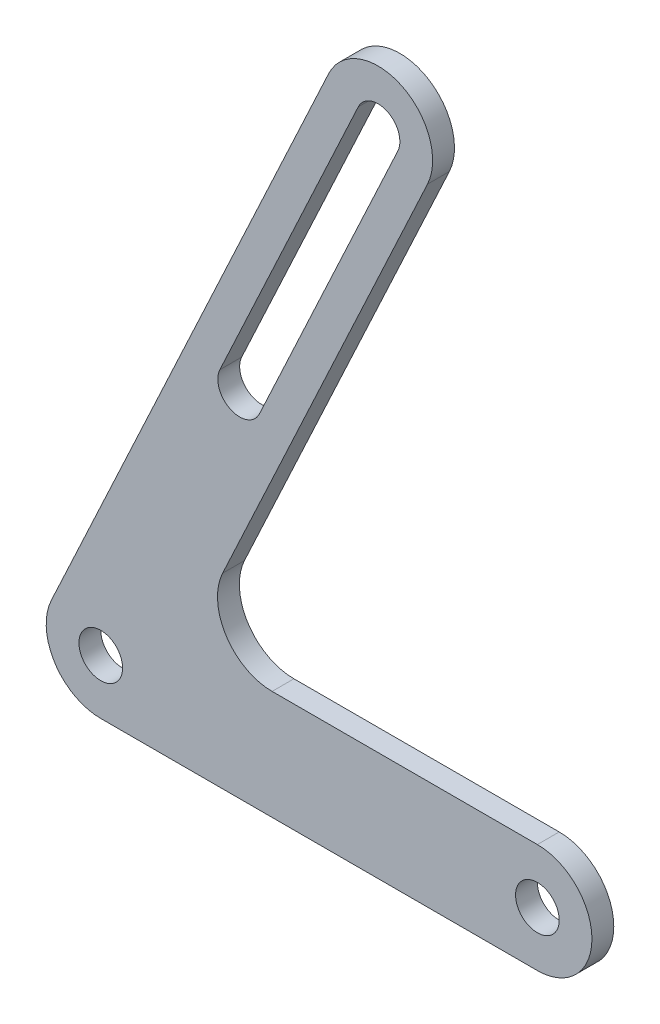
ISO-10303-21;
HEADER;
FILE_DESCRIPTION(('STEP AP214'),'2;1');
FILE_NAME('part.step','',(''),(''),'','','');
FILE_SCHEMA(('AUTOMOTIVE_DESIGN { 1 0 10303 214 1 1 1 1 }'));
ENDSEC;
DATA;
#1=APPLICATION_CONTEXT('core data for automotive mechanical design processes');
#2=APPLICATION_PROTOCOL_DEFINITION('international standard','automotive_design',2000,#1);
#3=PRODUCT_CONTEXT('',#1,'mechanical');
#4=PRODUCT('Part','Part','',(#3));
#5=PRODUCT_RELATED_PRODUCT_CATEGORY('part','',(#4));
#6=PRODUCT_DEFINITION_FORMATION('','',#4);
#7=PRODUCT_DEFINITION_CONTEXT('part definition',#1,'design');
#8=PRODUCT_DEFINITION('design','',#6,#7);
#9=PRODUCT_DEFINITION_SHAPE('','',#8);
#10=(LENGTH_UNIT() NAMED_UNIT(*) SI_UNIT(.MILLI.,.METRE.));
#11=(NAMED_UNIT(*) PLANE_ANGLE_UNIT() SI_UNIT($,.RADIAN.));
#12=(NAMED_UNIT(*) SI_UNIT($,.STERADIAN.) SOLID_ANGLE_UNIT());
#13=UNCERTAINTY_MEASURE_WITH_UNIT(LENGTH_MEASURE(1.E-05),#10,'distance_accuracy_value','');
#14=(GEOMETRIC_REPRESENTATION_CONTEXT(3) GLOBAL_UNCERTAINTY_ASSIGNED_CONTEXT((#13)) GLOBAL_UNIT_ASSIGNED_CONTEXT((#10,
#11,#12)) REPRESENTATION_CONTEXT('',''));
#15=CARTESIAN_POINT('',(0.,0.,0.));
#16=DIRECTION('',(0.,0.,1.));
#17=DIRECTION('',(1.,0.,0.));
#18=AXIS2_PLACEMENT_3D('',#15,#16,#17);
#19=CARTESIAN_POINT('',(-9.06307787036647,4.22618261740703,2.));
#20=DIRECTION('',(-0.906307787036648,0.422618261740704,0.));
#21=DIRECTION('',(-0.422618261740704,-0.906307787036648,0.));
#22=AXIS2_PLACEMENT_3D('',#19,#20,#21);
#23=PLANE('',#22);
#24=DIRECTION('',(0.422618261740704,0.906307787036648,0.));
#25=VECTOR('',#24,1.);
#26=CARTESIAN_POINT('',(-9.06307787036647,4.22618261740703,-2.));
#27=LINE('',#26,#25);
#28=CARTESIAN_POINT('',(-9.06307787036647,4.22618261740703,-2.));
#29=VERTEX_POINT('',#28);
#30=CARTESIAN_POINT('',(41.7428664291268,113.179881770692,-2.));
#31=VERTEX_POINT('',#30);
#32=EDGE_CURVE('E193',#29,#31,#27,.T.);
#33=ORIENTED_EDGE('',*,*,#32,.F.);
#34=DIRECTION('',(0.,0.,-1.));
#35=VECTOR('',#34,1.);
#36=CARTESIAN_POINT('',(-9.06307787036647,4.22618261740703,2.));
#37=LINE('',#36,#35);
#38=CARTESIAN_POINT('',(-9.06307787036647,4.22618261740703,2.));
#39=VERTEX_POINT('',#38);
#40=EDGE_CURVE('E259',#39,#29,#37,.T.);
#41=ORIENTED_EDGE('',*,*,#40,.F.);
#42=DIRECTION('',(0.422618261740704,0.906307787036648,0.));
#43=VECTOR('',#42,1.);
#44=CARTESIAN_POINT('',(-9.06307787036647,4.22618261740703,2.));
#45=LINE('',#44,#43);
#46=CARTESIAN_POINT('',(41.7428664291268,113.179881770692,2.));
#47=VERTEX_POINT('',#46);
#48=EDGE_CURVE('E194',#39,#47,#45,.T.);
#49=ORIENTED_EDGE('',*,*,#48,.T.);
#50=DIRECTION('',(0.,0.,-1.));
#51=VECTOR('',#50,1.);
#52=CARTESIAN_POINT('',(41.7428664291268,113.179881770692,2.));
#53=LINE('',#52,#51);
#54=EDGE_CURVE('E218',#47,#31,#53,.T.);
#55=ORIENTED_EDGE('',*,*,#54,.T.);
#56=EDGE_LOOP('',(#33,#41,#49,#55));
#57=FACE_BOUND('',#56,.T.);
#58=ADVANCED_FACE('F41',(#57),#23,.T.);
#59=CARTESIAN_POINT('',(0.,0.,2.));
#60=DIRECTION('',(0.,0.,-1.));
#61=DIRECTION('',(-1.,0.,0.));
#62=AXIS2_PLACEMENT_3D('',#59,#60,#61);
#63=CYLINDRICAL_SURFACE('',#62,10.);
#64=CARTESIAN_POINT('',(0.,0.,-2.));
#65=DIRECTION('',(0.,0.,1.));
#66=DIRECTION('',(1.,0.,0.));
#67=AXIS2_PLACEMENT_3D('',#64,#65,#66);
#68=CIRCLE('',#67,10.);
#69=CARTESIAN_POINT('',(0.,-10.,-2.));
#70=VERTEX_POINT('',#69);
#71=EDGE_CURVE('E222',#29,#70,#68,.T.);
#72=ORIENTED_EDGE('',*,*,#71,.T.);
#73=DIRECTION('',(0.,0.,-1.));
#74=VECTOR('',#73,1.);
#75=CARTESIAN_POINT('',(0.,-10.,2.));
#76=LINE('',#75,#74);
#77=CARTESIAN_POINT('',(0.,-10.,2.));
#78=VERTEX_POINT('',#77);
#79=EDGE_CURVE('E255',#78,#70,#76,.T.);
#80=ORIENTED_EDGE('',*,*,#79,.F.);
#81=CARTESIAN_POINT('',(0.,0.,2.));
#82=DIRECTION('',(0.,0.,1.));
#83=DIRECTION('',(1.,0.,0.));
#84=AXIS2_PLACEMENT_3D('',#81,#82,#83);
#85=CIRCLE('',#84,10.);
#86=EDGE_CURVE('E198',#39,#78,#85,.T.);
#87=ORIENTED_EDGE('',*,*,#86,.F.);
#88=ORIENTED_EDGE('',*,*,#40,.T.);
#89=EDGE_LOOP('',(#72,#80,#87,#88));
#90=FACE_BOUND('',#89,.T.);
#91=ADVANCED_FACE('F298',(#90),#63,.T.);
#92=CARTESIAN_POINT('',(0.,-10.,2.));
#93=DIRECTION('',(0.,1.,0.));
#94=DIRECTION('',(0.,0.,1.));
#95=AXIS2_PLACEMENT_3D('',#92,#93,#94);
#96=PLANE('',#95);
#97=DIRECTION('',(1.,0.,0.));
#98=VECTOR('',#97,1.);
#99=CARTESIAN_POINT('',(0.,-10.,-2.));
#100=LINE('',#99,#98);
#101=CARTESIAN_POINT('',(80.,-10.,-2.));
#102=VERTEX_POINT('',#101);
#103=EDGE_CURVE('E225',#70,#102,#100,.T.);
#104=ORIENTED_EDGE('',*,*,#103,.T.);
#105=DIRECTION('',(0.,0.,-1.));
#106=VECTOR('',#105,1.);
#107=CARTESIAN_POINT('',(80.,-10.,2.));
#108=LINE('',#107,#106);
#109=CARTESIAN_POINT('',(80.,-10.,2.));
#110=VERTEX_POINT('',#109);
#111=EDGE_CURVE('E251',#110,#102,#108,.T.);
#112=ORIENTED_EDGE('',*,*,#111,.F.);
#113=DIRECTION('',(1.,0.,0.));
#114=VECTOR('',#113,1.);
#115=CARTESIAN_POINT('',(0.,-10.,2.));
#116=LINE('',#115,#114);
#117=EDGE_CURVE('E202',#78,#110,#116,.T.);
#118=ORIENTED_EDGE('',*,*,#117,.F.);
#119=ORIENTED_EDGE('',*,*,#79,.T.);
#120=EDGE_LOOP('',(#104,#112,#118,#119));
#121=FACE_BOUND('',#120,.T.);
#122=ADVANCED_FACE('F303',(#121),#96,.F.);
#123=CARTESIAN_POINT('',(80.,0.,2.));
#124=DIRECTION('',(0.,0.,-1.));
#125=DIRECTION('',(-1.,0.,0.));
#126=AXIS2_PLACEMENT_3D('',#123,#124,#125);
#127=CYLINDRICAL_SURFACE('',#126,10.);
#128=CARTESIAN_POINT('',(80.,0.,-2.));
#129=DIRECTION('',(0.,0.,1.));
#130=DIRECTION('',(1.,0.,0.));
#131=AXIS2_PLACEMENT_3D('',#128,#129,#130);
#132=CIRCLE('',#131,10.);
#133=CARTESIAN_POINT('',(80.,10.,-2.));
#134=VERTEX_POINT('',#133);
#135=EDGE_CURVE('E228',#102,#134,#132,.T.);
#136=ORIENTED_EDGE('',*,*,#135,.T.);
#137=DIRECTION('',(0.,0.,-1.));
#138=VECTOR('',#137,1.);
#139=CARTESIAN_POINT('',(80.,10.,2.));
#140=LINE('',#139,#138);
#141=CARTESIAN_POINT('',(80.,10.,2.));
#142=VERTEX_POINT('',#141);
#143=EDGE_CURVE('E247',#142,#134,#140,.T.);
#144=ORIENTED_EDGE('',*,*,#143,.F.);
#145=CARTESIAN_POINT('',(80.,0.,2.));
#146=DIRECTION('',(0.,0.,1.));
#147=DIRECTION('',(1.,0.,0.));
#148=AXIS2_PLACEMENT_3D('',#145,#146,#147);
#149=CIRCLE('',#148,10.);
#150=EDGE_CURVE('E205',#110,#142,#149,.T.);
#151=ORIENTED_EDGE('',*,*,#150,.F.);
#152=ORIENTED_EDGE('',*,*,#111,.T.);
#153=EDGE_LOOP('',(#136,#144,#151,#152));
#154=FACE_BOUND('',#153,.T.);
#155=ADVANCED_FACE('F310',(#154),#127,.T.);
#156=CARTESIAN_POINT('',(0.,10.,2.));
#157=DIRECTION('',(0.,1.,0.));
#158=DIRECTION('',(0.,0.,1.));
#159=AXIS2_PLACEMENT_3D('',#156,#157,#158);
#160=PLANE('',#159);
#161=DIRECTION('',(1.,0.,0.));
#162=VECTOR('',#161,1.);
#163=CARTESIAN_POINT('',(0.,10.,-2.));
#164=LINE('',#163,#162);
#165=CARTESIAN_POINT('',(31.3937115423499,10.,-2.));
#166=VERTEX_POINT('',#165);
#167=EDGE_CURVE('E232',#166,#134,#164,.T.);
#168=ORIENTED_EDGE('',*,*,#167,.F.);
#169=DIRECTION('',(0.,0.,-1.));
#170=VECTOR('',#169,1.);
#171=CARTESIAN_POINT('',(31.3937115423499,10.,2.));
#172=LINE('',#171,#170);
#173=CARTESIAN_POINT('',(31.3937115423499,10.,2.));
#174=VERTEX_POINT('',#173);
#175=EDGE_CURVE('E57',#166,#174,#172,.F.);
#176=ORIENTED_EDGE('',*,*,#175,.T.);
#177=DIRECTION('',(1.,0.,0.));
#178=VECTOR('',#177,1.);
#179=CARTESIAN_POINT('',(0.,10.,2.));
#180=LINE('',#179,#178);
#181=EDGE_CURVE('E209',#174,#142,#180,.T.);
#182=ORIENTED_EDGE('',*,*,#181,.T.);
#183=ORIENTED_EDGE('',*,*,#143,.T.);
#184=EDGE_LOOP('',(#168,#176,#182,#183));
#185=FACE_BOUND('',#184,.T.);
#186=ADVANCED_FACE('F314',(#185),#160,.T.);
#187=CARTESIAN_POINT('',(9.06307787036647,-4.22618261740703,2.));
#188=DIRECTION('',(-0.906307787036648,0.422618261740703,0.));
#189=DIRECTION('',(-0.422618261740703,-0.906307787036648,0.));
#190=AXIS2_PLACEMENT_3D('',#187,#188,#189);
#191=PLANE('',#190);
#192=DIRECTION('',(0.422618261740703,0.906307787036648,0.));
#193=VECTOR('',#192,1.);
#194=CARTESIAN_POINT('',(9.06307787036647,-4.22618261740703,2.));
#195=LINE('',#194,#193);
#196=CARTESIAN_POINT('',(22.3306336719835,24.226182617407,2.));
#197=VERTEX_POINT('',#196);
#198=CARTESIAN_POINT('',(59.8690221698597,104.727516535878,2.));
#199=VERTEX_POINT('',#198);
#200=EDGE_CURVE('E212',#197,#199,#195,.T.);
#201=ORIENTED_EDGE('',*,*,#200,.F.);
#202=DIRECTION('',(0.,0.,-1.));
#203=VECTOR('',#202,1.);
#204=CARTESIAN_POINT('',(22.3306336719835,24.226182617407,2.));
#205=LINE('',#204,#203);
#206=CARTESIAN_POINT('',(22.3306336719835,24.226182617407,-2.));
#207=VERTEX_POINT('',#206);
#208=EDGE_CURVE('E262',#197,#207,#205,.T.);
#209=ORIENTED_EDGE('',*,*,#208,.T.);
#210=DIRECTION('',(0.422618261740703,0.906307787036648,0.));
#211=VECTOR('',#210,1.);
#212=CARTESIAN_POINT('',(9.06307787036647,-4.22618261740703,-2.));
#213=LINE('',#212,#211);
#214=CARTESIAN_POINT('',(59.8690221698597,104.727516535878,-2.));
#215=VERTEX_POINT('',#214);
#216=EDGE_CURVE('E235',#207,#215,#213,.T.);
#217=ORIENTED_EDGE('',*,*,#216,.T.);
#218=DIRECTION('',(0.,0.,-1.));
#219=VECTOR('',#218,1.);
#220=CARTESIAN_POINT('',(59.8690221698597,104.727516535878,2.));
#221=LINE('',#220,#219);
#222=EDGE_CURVE('E243',#199,#215,#221,.T.);
#223=ORIENTED_EDGE('',*,*,#222,.F.);
#224=EDGE_LOOP('',(#201,#209,#217,#223));
#225=FACE_BOUND('',#224,.T.);
#226=ADVANCED_FACE('F318',(#225),#191,.F.);
#227=CARTESIAN_POINT('',(50.8059442994933,108.953699153285,2.));
#228=DIRECTION('',(0.,0.,-1.));
#229=DIRECTION('',(-1.,0.,0.));
#230=AXIS2_PLACEMENT_3D('',#227,#228,#229);
#231=CYLINDRICAL_SURFACE('',#230,9.99999999999997);
#232=CARTESIAN_POINT('',(50.8059442994933,108.953699153285,-2.));
#233=DIRECTION('',(0.,0.,1.));
#234=DIRECTION('',(1.,0.,0.));
#235=AXIS2_PLACEMENT_3D('',#232,#233,#234);
#236=CIRCLE('',#235,9.99999999999997);
#237=EDGE_CURVE('E199',#215,#31,#236,.T.);
#238=ORIENTED_EDGE('',*,*,#237,.T.);
#239=ORIENTED_EDGE('',*,*,#54,.F.);
#240=CARTESIAN_POINT('',(50.8059442994933,108.953699153285,2.));
#241=DIRECTION('',(0.,0.,1.));
#242=DIRECTION('',(1.,0.,0.));
#243=AXIS2_PLACEMENT_3D('',#240,#241,#242);
#244=CIRCLE('',#243,9.99999999999997);
#245=EDGE_CURVE('E215',#199,#47,#244,.T.);
#246=ORIENTED_EDGE('',*,*,#245,.F.);
#247=ORIENTED_EDGE('',*,*,#222,.T.);
#248=EDGE_LOOP('',(#238,#239,#246,#247));
#249=FACE_BOUND('',#248,.T.);
#250=ADVANCED_FACE('F321',(#249),#231,.T.);
#251=CARTESIAN_POINT('',(0.,0.,2.));
#252=DIRECTION('',(0.,0.,1.));
#253=DIRECTION('',(1.,0.,0.));
#254=AXIS2_PLACEMENT_3D('',#251,#252,#253);
#255=PLANE('',#254);
#256=CARTESIAN_POINT('',(80.,0.,2.));
#257=DIRECTION('',(0.,0.,1.));
#258=DIRECTION('',(1.,0.,0.));
#259=AXIS2_PLACEMENT_3D('',#256,#257,#258);
#260=CIRCLE('',#259,4.00000000000001);
#261=CARTESIAN_POINT('',(84.,0.,2.));
#262=VERTEX_POINT('',#261);
#263=EDGE_CURVE('E189',#262,#262,#260,.F.);
#264=ORIENTED_EDGE('',*,*,#263,.T.);
#265=EDGE_LOOP('',(#264));
#266=FACE_BOUND('',#265,.T.);
#267=DIRECTION('',(0.422618261740704,0.906307787036648,0.));
#268=VECTOR('',#267,1.);
#269=CARTESIAN_POINT('',(-3.62523114814655,1.69047304696279,2.));
#270=LINE('',#269,#268);
#271=CARTESIAN_POINT('',(21.8236174469044,56.265704978049,2.));
#272=VERTEX_POINT('',#271);
#273=CARTESIAN_POINT('',(47.1807131513467,110.644172200248,2.));
#274=VERTEX_POINT('',#273);
#275=EDGE_CURVE('E181',#272,#274,#270,.T.);
#276=ORIENTED_EDGE('',*,*,#275,.T.);
#277=CARTESIAN_POINT('',(50.8059442994933,108.953699153285,2.));
#278=DIRECTION('',(0.,0.,1.));
#279=DIRECTION('',(1.,0.,0.));
#280=AXIS2_PLACEMENT_3D('',#277,#278,#279);
#281=CIRCLE('',#280,4.);
#282=CARTESIAN_POINT('',(54.4311754476398,107.263226106322,2.));
#283=VERTEX_POINT('',#282);
#284=EDGE_CURVE('E185',#274,#283,#281,.F.);
#285=ORIENTED_EDGE('',*,*,#284,.T.);
#286=DIRECTION('',(0.422618261740704,0.906307787036648,0.));
#287=VECTOR('',#286,1.);
#288=CARTESIAN_POINT('',(3.62523114814659,-1.69047304696281,2.));
#289=LINE('',#288,#287);
#290=CARTESIAN_POINT('',(29.0740797431976,52.8847588841234,2.));
#291=VERTEX_POINT('',#290);
#292=EDGE_CURVE('E176',#291,#283,#289,.T.);
#293=ORIENTED_EDGE('',*,*,#292,.F.);
#294=CARTESIAN_POINT('',(25.448848595051,54.5752319310862,2.));
#295=DIRECTION('',(0.,0.,1.));
#296=DIRECTION('',(1.,0.,0.));
#297=AXIS2_PLACEMENT_3D('',#294,#295,#296);
#298=CIRCLE('',#297,3.99999999999999);
#299=EDGE_CURVE('E137',#291,#272,#298,.F.);
#300=ORIENTED_EDGE('',*,*,#299,.T.);
#301=EDGE_LOOP('',(#276,#285,#293,#300));
#302=FACE_BOUND('',#301,.T.);
#303=CARTESIAN_POINT('',(0.,0.,2.));
#304=DIRECTION('',(0.,0.,1.));
#305=DIRECTION('',(1.,0.,0.));
#306=AXIS2_PLACEMENT_3D('',#303,#304,#305);
#307=CIRCLE('',#306,4.);
#308=CARTESIAN_POINT('',(4.,0.,2.));
#309=VERTEX_POINT('',#308);
#310=EDGE_CURVE('E172',#309,#309,#307,.F.);
#311=ORIENTED_EDGE('',*,*,#310,.T.);
#312=EDGE_LOOP('',(#311));
#313=FACE_BOUND('',#312,.T.);
#314=ORIENTED_EDGE('',*,*,#48,.F.);
#315=ORIENTED_EDGE('',*,*,#86,.T.);
#316=ORIENTED_EDGE('',*,*,#117,.T.);
#317=ORIENTED_EDGE('',*,*,#150,.T.);
#318=ORIENTED_EDGE('',*,*,#181,.F.);
#319=CARTESIAN_POINT('',(31.3937115423499,20.,2.));
#320=DIRECTION('',(0.,0.,1.));
#321=DIRECTION('',(1.,0.,0.));
#322=AXIS2_PLACEMENT_3D('',#319,#320,#321);
#323=CIRCLE('',#322,10.);
#324=EDGE_CURVE('E11',#174,#197,#323,.F.);
#325=ORIENTED_EDGE('',*,*,#324,.T.);
#326=ORIENTED_EDGE('',*,*,#200,.T.);
#327=ORIENTED_EDGE('',*,*,#245,.T.);
#328=EDGE_LOOP('',(#314,#315,#316,#317,#318,#325,#326,#327));
#329=FACE_BOUND('',#328,.T.);
#330=ADVANCED_FACE('F282',(#266,#302,#313,#329),#255,.T.);
#331=CARTESIAN_POINT('',(0.,0.,-2.));
#332=DIRECTION('',(0.,0.,1.));
#333=DIRECTION('',(1.,0.,0.));
#334=AXIS2_PLACEMENT_3D('',#331,#332,#333);
#335=PLANE('',#334);
#336=CARTESIAN_POINT('',(80.,0.,-2.));
#337=DIRECTION('',(0.,0.,1.));
#338=DIRECTION('',(1.,0.,0.));
#339=AXIS2_PLACEMENT_3D('',#336,#337,#338);
#340=CIRCLE('',#339,4.00000000000001);
#341=CARTESIAN_POINT('',(84.,0.,-2.));
#342=VERTEX_POINT('',#341);
#343=EDGE_CURVE('E166',#342,#342,#340,.T.);
#344=ORIENTED_EDGE('',*,*,#343,.T.);
#345=EDGE_LOOP('',(#344));
#346=FACE_BOUND('',#345,.T.);
#347=CARTESIAN_POINT('',(50.8059442994933,108.953699153285,-2.));
#348=DIRECTION('',(0.,0.,1.));
#349=DIRECTION('',(1.,0.,0.));
#350=AXIS2_PLACEMENT_3D('',#347,#348,#349);
#351=CIRCLE('',#350,4.);
#352=CARTESIAN_POINT('',(54.4311754476398,107.263226106322,-2.));
#353=VERTEX_POINT('',#352);
#354=CARTESIAN_POINT('',(47.1807131513467,110.644172200248,-2.));
#355=VERTEX_POINT('',#354);
#356=EDGE_CURVE('E160',#353,#355,#351,.T.);
#357=ORIENTED_EDGE('',*,*,#356,.T.);
#358=DIRECTION('',(-0.422618261740703,-0.906307787036648,0.));
#359=VECTOR('',#358,1.);
#360=CARTESIAN_POINT('',(47.1807131513467,110.644172200248,-2.));
#361=LINE('',#360,#359);
#362=CARTESIAN_POINT('',(21.8236174469044,56.265704978049,-2.));
#363=VERTEX_POINT('',#362);
#364=EDGE_CURVE('E156',#355,#363,#361,.T.);
#365=ORIENTED_EDGE('',*,*,#364,.T.);
#366=CARTESIAN_POINT('',(25.448848595051,54.5752319310862,-2.));
#367=DIRECTION('',(0.,0.,1.));
#368=DIRECTION('',(1.,0.,0.));
#369=AXIS2_PLACEMENT_3D('',#366,#367,#368);
#370=CIRCLE('',#369,3.99999999999999);
#371=CARTESIAN_POINT('',(29.0740797431976,52.8847588841234,-2.));
#372=VERTEX_POINT('',#371);
#373=EDGE_CURVE('E134',#363,#372,#370,.T.);
#374=ORIENTED_EDGE('',*,*,#373,.T.);
#375=DIRECTION('',(-0.422618261740704,-0.906307787036648,0.));
#376=VECTOR('',#375,1.);
#377=CARTESIAN_POINT('',(54.4311754476398,107.263226106322,-2.));
#378=LINE('',#377,#376);
#379=EDGE_CURVE('E146',#353,#372,#378,.T.);
#380=ORIENTED_EDGE('',*,*,#379,.F.);
#381=EDGE_LOOP('',(#357,#365,#374,#380));
#382=FACE_BOUND('',#381,.T.);
#383=CARTESIAN_POINT('',(0.,0.,-2.));
#384=DIRECTION('',(0.,0.,1.));
#385=DIRECTION('',(1.,0.,0.));
#386=AXIS2_PLACEMENT_3D('',#383,#384,#385);
#387=CIRCLE('',#386,4.);
#388=CARTESIAN_POINT('',(4.,0.,-2.));
#389=VERTEX_POINT('',#388);
#390=EDGE_CURVE('E167',#389,#389,#387,.T.);
#391=ORIENTED_EDGE('',*,*,#390,.T.);
#392=EDGE_LOOP('',(#391));
#393=FACE_BOUND('',#392,.T.);
#394=ORIENTED_EDGE('',*,*,#32,.T.);
#395=ORIENTED_EDGE('',*,*,#237,.F.);
#396=ORIENTED_EDGE('',*,*,#216,.F.);
#397=CARTESIAN_POINT('',(31.3937115423499,20.,-2.));
#398=DIRECTION('',(0.,0.,1.));
#399=DIRECTION('',(1.,0.,0.));
#400=AXIS2_PLACEMENT_3D('',#397,#398,#399);
#401=CIRCLE('',#400,10.);
#402=EDGE_CURVE('E50',#207,#166,#401,.T.);
#403=ORIENTED_EDGE('',*,*,#402,.T.);
#404=ORIENTED_EDGE('',*,*,#167,.T.);
#405=ORIENTED_EDGE('',*,*,#135,.F.);
#406=ORIENTED_EDGE('',*,*,#103,.F.);
#407=ORIENTED_EDGE('',*,*,#71,.F.);
#408=EDGE_LOOP('',(#394,#395,#396,#403,#404,#405,#406,#407));
#409=FACE_BOUND('',#408,.T.);
#410=ADVANCED_FACE('F153',(#346,#382,#393,#409),#335,.F.);
#411=CARTESIAN_POINT('',(0.,0.,4.));
#412=DIRECTION('',(0.,0.,-1.));
#413=DIRECTION('',(-1.,0.,0.));
#414=AXIS2_PLACEMENT_3D('',#411,#412,#413);
#415=CYLINDRICAL_SURFACE('',#414,4.);
#416=ORIENTED_EDGE('',*,*,#310,.F.);
#417=EDGE_LOOP('',(#416));
#418=FACE_BOUND('',#417,.T.);
#419=ORIENTED_EDGE('',*,*,#390,.F.);
#420=EDGE_LOOP('',(#419));
#421=FACE_BOUND('',#420,.T.);
#422=ADVANCED_FACE('F287',(#418,#421),#415,.F.);
#423=CARTESIAN_POINT('',(50.8059442994933,108.953699153285,4.));
#424=DIRECTION('',(0.,0.,-1.));
#425=DIRECTION('',(-1.,0.,0.));
#426=AXIS2_PLACEMENT_3D('',#423,#424,#425);
#427=CYLINDRICAL_SURFACE('',#426,4.);
#428=DIRECTION('',(0.,0.,-1.));
#429=VECTOR('',#428,1.);
#430=CARTESIAN_POINT('',(47.1807131513467,110.644172200248,4.));
#431=LINE('',#430,#429);
#432=EDGE_CURVE('E171',#274,#355,#431,.T.);
#433=ORIENTED_EDGE('',*,*,#432,.T.);
#434=ORIENTED_EDGE('',*,*,#356,.F.);
#435=DIRECTION('',(0.,0.,-1.));
#436=VECTOR('',#435,1.);
#437=CARTESIAN_POINT('',(54.4311754476398,107.263226106322,4.));
#438=LINE('',#437,#436);
#439=EDGE_CURVE('E141',#283,#353,#438,.T.);
#440=ORIENTED_EDGE('',*,*,#439,.F.);
#441=ORIENTED_EDGE('',*,*,#284,.F.);
#442=EDGE_LOOP('',(#433,#434,#440,#441));
#443=FACE_BOUND('',#442,.T.);
#444=ADVANCED_FACE('F285',(#443),#427,.F.);
#445=CARTESIAN_POINT('',(47.1807131513467,110.644172200248,4.));
#446=DIRECTION('',(0.906307787036648,-0.422618261740704,0.));
#447=DIRECTION('',(0.422618261740704,0.906307787036648,0.));
#448=AXIS2_PLACEMENT_3D('',#445,#446,#447);
#449=PLANE('',#448);
#450=DIRECTION('',(0.,0.,-1.));
#451=VECTOR('',#450,1.);
#452=CARTESIAN_POINT('',(21.8236174469044,56.265704978049,4.));
#453=LINE('',#452,#451);
#454=EDGE_CURVE('E142',#272,#363,#453,.T.);
#455=ORIENTED_EDGE('',*,*,#454,.T.);
#456=ORIENTED_EDGE('',*,*,#364,.F.);
#457=ORIENTED_EDGE('',*,*,#432,.F.);
#458=ORIENTED_EDGE('',*,*,#275,.F.);
#459=EDGE_LOOP('',(#455,#456,#457,#458));
#460=FACE_BOUND('',#459,.T.);
#461=ADVANCED_FACE('F279',(#460),#449,.T.);
#462=CARTESIAN_POINT('',(25.448848595051,54.5752319310862,4.));
#463=DIRECTION('',(0.,0.,-1.));
#464=DIRECTION('',(-1.,0.,0.));
#465=AXIS2_PLACEMENT_3D('',#462,#463,#464);
#466=CYLINDRICAL_SURFACE('',#465,3.99999999999999);
#467=DIRECTION('',(0.,0.,-1.));
#468=VECTOR('',#467,1.);
#469=CARTESIAN_POINT('',(29.0740797431976,52.8847588841234,4.));
#470=LINE('',#469,#468);
#471=EDGE_CURVE('E129',#291,#372,#470,.T.);
#472=ORIENTED_EDGE('',*,*,#471,.T.);
#473=ORIENTED_EDGE('',*,*,#373,.F.);
#474=ORIENTED_EDGE('',*,*,#454,.F.);
#475=ORIENTED_EDGE('',*,*,#299,.F.);
#476=EDGE_LOOP('',(#472,#473,#474,#475));
#477=FACE_BOUND('',#476,.T.);
#478=ADVANCED_FACE('F131',(#477),#466,.F.);
#479=CARTESIAN_POINT('',(54.4311754476398,107.263226106322,4.));
#480=DIRECTION('',(0.906307787036648,-0.422618261740704,0.));
#481=DIRECTION('',(0.422618261740704,0.906307787036648,0.));
#482=AXIS2_PLACEMENT_3D('',#479,#480,#481);
#483=PLANE('',#482);
#484=ORIENTED_EDGE('',*,*,#292,.T.);
#485=ORIENTED_EDGE('',*,*,#439,.T.);
#486=ORIENTED_EDGE('',*,*,#379,.T.);
#487=ORIENTED_EDGE('',*,*,#471,.F.);
#488=EDGE_LOOP('',(#484,#485,#486,#487));
#489=FACE_BOUND('',#488,.T.);
#490=ADVANCED_FACE('F147',(#489),#483,.F.);
#491=CARTESIAN_POINT('',(80.,0.,4.));
#492=DIRECTION('',(0.,0.,-1.));
#493=DIRECTION('',(-1.,0.,0.));
#494=AXIS2_PLACEMENT_3D('',#491,#492,#493);
#495=CYLINDRICAL_SURFACE('',#494,4.00000000000001);
#496=ORIENTED_EDGE('',*,*,#263,.F.);
#497=EDGE_LOOP('',(#496));
#498=FACE_BOUND('',#497,.T.);
#499=ORIENTED_EDGE('',*,*,#343,.F.);
#500=EDGE_LOOP('',(#499));
#501=FACE_BOUND('',#500,.T.);
#502=ADVANCED_FACE('F333',(#498,#501),#495,.F.);
#503=CARTESIAN_POINT('',(31.3937115423499,20.,2.));
#504=DIRECTION('',(0.,0.,-1.));
#505=DIRECTION('',(-1.,0.,0.));
#506=AXIS2_PLACEMENT_3D('',#503,#504,#505);
#507=CYLINDRICAL_SURFACE('',#506,10.);
#508=ORIENTED_EDGE('',*,*,#324,.F.);
#509=ORIENTED_EDGE('',*,*,#175,.F.);
#510=ORIENTED_EDGE('',*,*,#402,.F.);
#511=ORIENTED_EDGE('',*,*,#208,.F.);
#512=EDGE_LOOP('',(#508,#509,#510,#511));
#513=FACE_BOUND('',#512,.T.);
#514=ADVANCED_FACE('F43',(#513),#507,.F.);
#515=CLOSED_SHELL('',(#58,#91,#122,#155,#186,#226,#250,#330,#410,#422,#444,#461,#478,#490,#502,#514));
#516=MANIFOLD_SOLID_BREP('B2',#515);
#517=ADVANCED_BREP_SHAPE_REPRESENTATION('',(#18,#516),#14);
#518=SHAPE_DEFINITION_REPRESENTATION(#9,#517);
ENDSEC;
END-ISO-10303-21;
